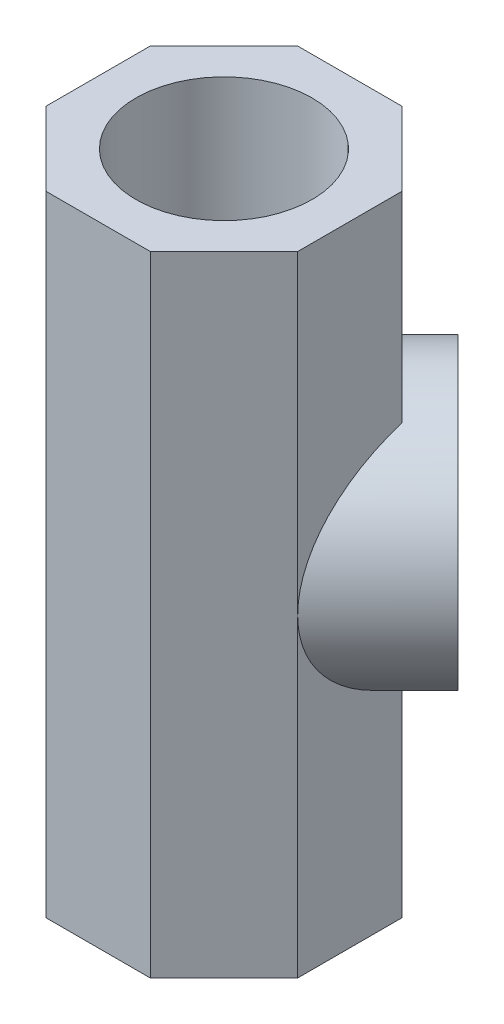
ISO-10303-21;
HEADER;
FILE_DESCRIPTION(('STEP AP214'),'2;1');
FILE_NAME('part.step','',(''),(''),'','','');
FILE_SCHEMA(('AUTOMOTIVE_DESIGN { 1 0 10303 214 1 1 1 1 }'));
ENDSEC;
DATA;
#1=APPLICATION_CONTEXT('core data for automotive mechanical design processes');
#2=APPLICATION_PROTOCOL_DEFINITION('international standard','automotive_design',2000,#1);
#3=PRODUCT_CONTEXT('',#1,'mechanical');
#4=PRODUCT('Part','Part','',(#3));
#5=PRODUCT_RELATED_PRODUCT_CATEGORY('part','',(#4));
#6=PRODUCT_DEFINITION_FORMATION('','',#4);
#7=PRODUCT_DEFINITION_CONTEXT('part definition',#1,'design');
#8=PRODUCT_DEFINITION('design','',#6,#7);
#9=PRODUCT_DEFINITION_SHAPE('','',#8);
#10=(LENGTH_UNIT() NAMED_UNIT(*) SI_UNIT(.MILLI.,.METRE.));
#11=(NAMED_UNIT(*) PLANE_ANGLE_UNIT() SI_UNIT($,.RADIAN.));
#12=(NAMED_UNIT(*) SI_UNIT($,.STERADIAN.) SOLID_ANGLE_UNIT());
#13=UNCERTAINTY_MEASURE_WITH_UNIT(LENGTH_MEASURE(1.E-05),#10,'distance_accuracy_value','');
#14=(GEOMETRIC_REPRESENTATION_CONTEXT(3) GLOBAL_UNCERTAINTY_ASSIGNED_CONTEXT((#13)) GLOBAL_UNIT_ASSIGNED_CONTEXT((#10,
#11,#12)) REPRESENTATION_CONTEXT('',''));
#15=CARTESIAN_POINT('',(0.,0.,0.));
#16=DIRECTION('',(0.,0.,1.));
#17=DIRECTION('',(1.,0.,0.));
#18=AXIS2_PLACEMENT_3D('',#15,#16,#17);
#19=CARTESIAN_POINT('',(15.875,79.375,6.57564030267288));
#20=DIRECTION('',(-1.,0.,0.));
#21=DIRECTION('',(0.,0.,1.));
#22=AXIS2_PLACEMENT_3D('',#19,#20,#21);
#23=PLANE('',#22);
#24=DIRECTION('',(0.,-1.,0.));
#25=VECTOR('',#24,1.);
#26=CARTESIAN_POINT('',(15.875,79.375,-6.57564030267288));
#27=LINE('',#26,#25);
#28=CARTESIAN_POINT('',(15.875,25.1855749109129,-6.57564030267288));
#29=VERTEX_POINT('',#28);
#30=CARTESIAN_POINT('',(15.875,0.,-6.57564030267288));
#31=VERTEX_POINT('',#30);
#32=EDGE_CURVE('E171',#29,#31,#27,.T.);
#33=ORIENTED_EDGE('',*,*,#32,.F.);
#34=CARTESIAN_POINT('',(15.8749999999372,39.6346779837838,-15.8749999999372));
#35=DIRECTION('',(-1.,0.,0.));
#36=DIRECTION('',(0.,0.,-1.));
#37=AXIS2_PLACEMENT_3D('',#34,#35,#36);
#38=ELLIPSE('',#37,22.4506403026729,15.875);
#39=CARTESIAN_POINT('',(15.8749999999373,39.6346779837838,6.57564030273563));
#40=VERTEX_POINT('',#39);
#41=EDGE_CURVE('E185',#40,#29,#38,.F.);
#42=ORIENTED_EDGE('',*,*,#41,.F.);
#43=DIRECTION('',(0.,-1.,0.));
#44=VECTOR('',#43,1.);
#45=CARTESIAN_POINT('',(15.875,79.375,6.57564030267288));
#46=LINE('',#45,#44);
#47=CARTESIAN_POINT('',(15.875,0.,6.57564030267288));
#48=VERTEX_POINT('',#47);
#49=EDGE_CURVE('E174',#40,#48,#46,.T.);
#50=ORIENTED_EDGE('',*,*,#49,.T.);
#51=DIRECTION('',(0.,0.,-1.));
#52=VECTOR('',#51,1.);
#53=CARTESIAN_POINT('',(15.875,0.,6.57564030267288));
#54=LINE('',#53,#52);
#55=EDGE_CURVE('E149',#48,#31,#54,.T.);
#56=ORIENTED_EDGE('',*,*,#55,.T.);
#57=EDGE_LOOP('',(#33,#42,#50,#56));
#58=FACE_BOUND('',#57,.T.);
#59=ADVANCED_FACE('F33',(#58),#23,.F.);
#60=CARTESIAN_POINT('',(15.875,79.375,-6.57564030267288));
#61=DIRECTION('',(-0.707106781186547,0.,0.707106781186548));
#62=DIRECTION('',(0.707106781186548,0.,0.707106781186547));
#63=AXIS2_PLACEMENT_3D('',#60,#61,#62);
#64=PLANE('',#63);
#65=CARTESIAN_POINT('',(15.875,79.375,-6.57564030267288));
#66=VERTEX_POINT('',#65);
#67=CARTESIAN_POINT('',(15.8749999999464,54.0837810566528,-6.5756403026193));
#68=VERTEX_POINT('',#67);
#69=EDGE_CURVE('E172',#66,#68,#27,.T.);
#70=ORIENTED_EDGE('',*,*,#69,.T.);
#71=CARTESIAN_POINT('',(11.2253201513113,39.6346779837838,-11.2253201512544));
#72=DIRECTION('',(-0.707106781186547,0.,0.707106781186548));
#73=DIRECTION('',(0.707106781186548,0.,0.707106781186547));
#74=AXIS2_PLACEMENT_3D('',#71,#72,#73);
#75=CIRCLE('',#74,15.875);
#76=CARTESIAN_POINT('',(6.57564030267287,54.0837810566181,-15.875));
#77=VERTEX_POINT('',#76);
#78=EDGE_CURVE('E211',#77,#68,#75,.F.);
#79=ORIENTED_EDGE('',*,*,#78,.F.);
#80=DIRECTION('',(0.,-1.,0.));
#81=VECTOR('',#80,1.);
#82=CARTESIAN_POINT('',(6.57564030267287,79.375,-15.875));
#83=LINE('',#82,#81);
#84=CARTESIAN_POINT('',(6.57564030267287,79.375,-15.875));
#85=VERTEX_POINT('',#84);
#86=EDGE_CURVE('E168',#85,#77,#83,.T.);
#87=ORIENTED_EDGE('',*,*,#86,.F.);
#88=DIRECTION('',(-0.707106781186548,0.,-0.707106781186547));
#89=VECTOR('',#88,1.);
#90=CARTESIAN_POINT('',(15.875,79.375,-6.57564030267288));
#91=LINE('',#90,#89);
#92=EDGE_CURVE('E226',#66,#85,#91,.T.);
#93=ORIENTED_EDGE('',*,*,#92,.F.);
#94=EDGE_LOOP('',(#70,#79,#87,#93));
#95=FACE_BOUND('',#94,.T.);
#96=ADVANCED_FACE('F230',(#95),#64,.F.);
#97=CARTESIAN_POINT('',(6.57564030267287,79.375,-15.875));
#98=DIRECTION('',(0.,0.,1.));
#99=DIRECTION('',(1.,0.,0.));
#100=AXIS2_PLACEMENT_3D('',#97,#98,#99);
#101=PLANE('',#100);
#102=ORIENTED_EDGE('',*,*,#86,.T.);
#103=CARTESIAN_POINT('',(15.8750000000509,39.6346779837838,-15.8749999999941));
#104=DIRECTION('',(0.,0.,1.));
#105=DIRECTION('',(1.,0.,0.));
#106=AXIS2_PLACEMENT_3D('',#103,#104,#105);
#107=ELLIPSE('',#106,22.4506403026729,15.875);
#108=CARTESIAN_POINT('',(-6.57564030262195,39.6346779837838,-15.8749999999941));
#109=VERTEX_POINT('',#108);
#110=EDGE_CURVE('E233',#109,#77,#107,.F.);
#111=ORIENTED_EDGE('',*,*,#110,.F.);
#112=DIRECTION('',(0.,-1.,0.));
#113=VECTOR('',#112,1.);
#114=CARTESIAN_POINT('',(-6.57564030267289,79.375,-15.875));
#115=LINE('',#114,#113);
#116=CARTESIAN_POINT('',(-6.57564030267289,79.375,-15.875));
#117=VERTEX_POINT('',#116);
#118=EDGE_CURVE('E165',#117,#109,#115,.T.);
#119=ORIENTED_EDGE('',*,*,#118,.F.);
#120=DIRECTION('',(-1.,0.,0.));
#121=VECTOR('',#120,1.);
#122=CARTESIAN_POINT('',(6.57564030267287,79.375,-15.875));
#123=LINE('',#122,#121);
#124=EDGE_CURVE('E121',#85,#117,#123,.T.);
#125=ORIENTED_EDGE('',*,*,#124,.F.);
#126=EDGE_LOOP('',(#102,#111,#119,#125));
#127=FACE_BOUND('',#126,.T.);
#128=ADVANCED_FACE('F232',(#127),#101,.F.);
#129=CARTESIAN_POINT('',(0.,79.375,0.));
#130=DIRECTION('',(0.,1.,0.));
#131=DIRECTION('',(0.,0.,1.));
#132=AXIS2_PLACEMENT_3D('',#129,#130,#131);
#133=PLANE('',#132);
#134=DIRECTION('',(1.,0.,0.));
#135=VECTOR('',#134,1.);
#136=CARTESIAN_POINT('',(-6.57564030267289,79.375,15.875));
#137=LINE('',#136,#135);
#138=CARTESIAN_POINT('',(-6.57564030267289,79.375,15.875));
#139=VERTEX_POINT('',#138);
#140=CARTESIAN_POINT('',(6.57564030267288,79.375,15.875));
#141=VERTEX_POINT('',#140);
#142=EDGE_CURVE('E162',#139,#141,#137,.T.);
#143=ORIENTED_EDGE('',*,*,#142,.T.);
#144=DIRECTION('',(0.707106781186548,0.,-0.707106781186548));
#145=VECTOR('',#144,1.);
#146=CARTESIAN_POINT('',(6.57564030267288,79.375,15.875));
#147=LINE('',#146,#145);
#148=CARTESIAN_POINT('',(15.875,79.375,6.57564030267288));
#149=VERTEX_POINT('',#148);
#150=EDGE_CURVE('E98',#141,#149,#147,.T.);
#151=ORIENTED_EDGE('',*,*,#150,.T.);
#152=DIRECTION('',(0.,0.,-1.));
#153=VECTOR('',#152,1.);
#154=CARTESIAN_POINT('',(15.875,79.375,6.57564030267288));
#155=LINE('',#154,#153);
#156=EDGE_CURVE('E224',#149,#66,#155,.T.);
#157=ORIENTED_EDGE('',*,*,#156,.T.);
#158=ORIENTED_EDGE('',*,*,#92,.T.);
#159=ORIENTED_EDGE('',*,*,#124,.T.);
#160=DIRECTION('',(-0.707106781186547,0.,0.707106781186548));
#161=VECTOR('',#160,1.);
#162=CARTESIAN_POINT('',(-6.57564030267289,79.375,-15.875));
#163=LINE('',#162,#161);
#164=CARTESIAN_POINT('',(-15.875,79.375,-6.57564030267288));
#165=VERTEX_POINT('',#164);
#166=EDGE_CURVE('E113',#117,#165,#163,.T.);
#167=ORIENTED_EDGE('',*,*,#166,.T.);
#168=DIRECTION('',(0.,0.,1.));
#169=VECTOR('',#168,1.);
#170=CARTESIAN_POINT('',(-15.875,79.375,-6.57564030267288));
#171=LINE('',#170,#169);
#172=CARTESIAN_POINT('',(-15.875,79.375,6.57564030267289));
#173=VERTEX_POINT('',#172);
#174=EDGE_CURVE('E118',#165,#173,#171,.T.);
#175=ORIENTED_EDGE('',*,*,#174,.T.);
#176=DIRECTION('',(0.707106781186547,0.,0.707106781186547));
#177=VECTOR('',#176,1.);
#178=CARTESIAN_POINT('',(-15.875,79.375,6.57564030267289));
#179=LINE('',#178,#177);
#180=EDGE_CURVE('E57',#173,#139,#179,.T.);
#181=ORIENTED_EDGE('',*,*,#180,.T.);
#182=EDGE_LOOP('',(#143,#151,#157,#158,#159,#167,#175,#181));
#183=FACE_BOUND('',#182,.T.);
#184=CARTESIAN_POINT('',(0.,79.375,0.));
#185=DIRECTION('',(0.,1.,0.));
#186=DIRECTION('',(0.,0.,1.));
#187=AXIS2_PLACEMENT_3D('',#184,#185,#186);
#188=CIRCLE('',#187,11.1125);
#189=CARTESIAN_POINT('',(0.,79.375,-11.1125));
#190=VERTEX_POINT('',#189);
#191=EDGE_CURVE('E146',#190,#190,#188,.T.);
#192=ORIENTED_EDGE('',*,*,#191,.F.);
#193=EDGE_LOOP('',(#192));
#194=FACE_BOUND('',#193,.T.);
#195=ADVANCED_FACE('F115',(#183,#194),#133,.T.);
#196=CARTESIAN_POINT('',(0.,0.,0.));
#197=DIRECTION('',(0.,1.,0.));
#198=DIRECTION('',(0.,0.,1.));
#199=AXIS2_PLACEMENT_3D('',#196,#197,#198);
#200=PLANE('',#199);
#201=DIRECTION('',(1.,0.,0.));
#202=VECTOR('',#201,1.);
#203=CARTESIAN_POINT('',(-6.57564030267289,0.,15.875));
#204=LINE('',#203,#202);
#205=CARTESIAN_POINT('',(-6.57564030267289,0.,15.875));
#206=VERTEX_POINT('',#205);
#207=CARTESIAN_POINT('',(6.57564030267288,0.,15.875));
#208=VERTEX_POINT('',#207);
#209=EDGE_CURVE('E142',#206,#208,#204,.T.);
#210=ORIENTED_EDGE('',*,*,#209,.F.);
#211=DIRECTION('',(0.707106781186547,0.,0.707106781186547));
#212=VECTOR('',#211,1.);
#213=CARTESIAN_POINT('',(-15.875,0.,6.57564030267289));
#214=LINE('',#213,#212);
#215=CARTESIAN_POINT('',(-15.875,0.,6.57564030267289));
#216=VERTEX_POINT('',#215);
#217=EDGE_CURVE('E90',#216,#206,#214,.T.);
#218=ORIENTED_EDGE('',*,*,#217,.F.);
#219=DIRECTION('',(0.,0.,1.));
#220=VECTOR('',#219,1.);
#221=CARTESIAN_POINT('',(-15.875,0.,-6.57564030267288));
#222=LINE('',#221,#220);
#223=CARTESIAN_POINT('',(-15.875,0.,-6.57564030267288));
#224=VERTEX_POINT('',#223);
#225=EDGE_CURVE('E159',#224,#216,#222,.T.);
#226=ORIENTED_EDGE('',*,*,#225,.F.);
#227=DIRECTION('',(-0.707106781186547,0.,0.707106781186548));
#228=VECTOR('',#227,1.);
#229=CARTESIAN_POINT('',(-6.57564030267289,0.,-15.875));
#230=LINE('',#229,#228);
#231=CARTESIAN_POINT('',(-6.57564030267289,0.,-15.875));
#232=VERTEX_POINT('',#231);
#233=EDGE_CURVE('E130',#232,#224,#230,.T.);
#234=ORIENTED_EDGE('',*,*,#233,.F.);
#235=DIRECTION('',(-1.,0.,0.));
#236=VECTOR('',#235,1.);
#237=CARTESIAN_POINT('',(6.57564030267287,0.,-15.875));
#238=LINE('',#237,#236);
#239=CARTESIAN_POINT('',(6.57564030267287,0.,-15.875));
#240=VERTEX_POINT('',#239);
#241=EDGE_CURVE('E155',#240,#232,#238,.T.);
#242=ORIENTED_EDGE('',*,*,#241,.F.);
#243=DIRECTION('',(-0.707106781186548,0.,-0.707106781186547));
#244=VECTOR('',#243,1.);
#245=CARTESIAN_POINT('',(15.875,0.,-6.57564030267288));
#246=LINE('',#245,#244);
#247=EDGE_CURVE('E152',#31,#240,#246,.T.);
#248=ORIENTED_EDGE('',*,*,#247,.F.);
#249=ORIENTED_EDGE('',*,*,#55,.F.);
#250=DIRECTION('',(0.707106781186548,0.,-0.707106781186548));
#251=VECTOR('',#250,1.);
#252=CARTESIAN_POINT('',(6.57564030267288,0.,15.875));
#253=LINE('',#252,#251);
#254=EDGE_CURVE('E145',#208,#48,#253,.T.);
#255=ORIENTED_EDGE('',*,*,#254,.F.);
#256=EDGE_LOOP('',(#210,#218,#226,#234,#242,#248,#249,#255));
#257=FACE_BOUND('',#256,.T.);
#258=CARTESIAN_POINT('',(0.,0.,0.));
#259=DIRECTION('',(0.,1.,0.));
#260=DIRECTION('',(0.,0.,1.));
#261=AXIS2_PLACEMENT_3D('',#258,#259,#260);
#262=CIRCLE('',#261,11.1125);
#263=CARTESIAN_POINT('',(0.,0.,-11.1125));
#264=VERTEX_POINT('',#263);
#265=EDGE_CURVE('E214',#264,#264,#262,.T.);
#266=ORIENTED_EDGE('',*,*,#265,.T.);
#267=EDGE_LOOP('',(#266));
#268=FACE_BOUND('',#267,.T.);
#269=ADVANCED_FACE('F190',(#257,#268),#200,.F.);
#270=CARTESIAN_POINT('',(-6.57564030267289,79.375,15.875));
#271=DIRECTION('',(0.,0.,-1.));
#272=DIRECTION('',(-1.,0.,0.));
#273=AXIS2_PLACEMENT_3D('',#270,#271,#272);
#274=PLANE('',#273);
#275=ORIENTED_EDGE('',*,*,#209,.T.);
#276=DIRECTION('',(0.,-1.,0.));
#277=VECTOR('',#276,1.);
#278=CARTESIAN_POINT('',(6.57564030267288,79.375,15.875));
#279=LINE('',#278,#277);
#280=EDGE_CURVE('E11',#141,#208,#279,.T.);
#281=ORIENTED_EDGE('',*,*,#280,.F.);
#282=ORIENTED_EDGE('',*,*,#142,.F.);
#283=DIRECTION('',(0.,-1.,0.));
#284=VECTOR('',#283,1.);
#285=CARTESIAN_POINT('',(-6.57564030267289,79.375,15.875));
#286=LINE('',#285,#284);
#287=EDGE_CURVE('E138',#139,#206,#286,.T.);
#288=ORIENTED_EDGE('',*,*,#287,.T.);
#289=EDGE_LOOP('',(#275,#281,#282,#288));
#290=FACE_BOUND('',#289,.T.);
#291=ADVANCED_FACE('F35',(#290),#274,.F.);
#292=CARTESIAN_POINT('',(6.57564030267288,79.375,15.875));
#293=DIRECTION('',(-0.707106781186548,0.,-0.707106781186547));
#294=DIRECTION('',(-0.707106781186547,0.,0.707106781186548));
#295=AXIS2_PLACEMENT_3D('',#292,#293,#294);
#296=PLANE('',#295);
#297=ORIENTED_EDGE('',*,*,#254,.T.);
#298=ORIENTED_EDGE('',*,*,#49,.F.);
#299=EDGE_CURVE('E41',#149,#40,#46,.T.);
#300=ORIENTED_EDGE('',*,*,#299,.F.);
#301=ORIENTED_EDGE('',*,*,#150,.F.);
#302=ORIENTED_EDGE('',*,*,#280,.T.);
#303=EDGE_LOOP('',(#297,#298,#300,#301,#302));
#304=FACE_BOUND('',#303,.T.);
#305=ADVANCED_FACE('F186',(#304),#296,.F.);
#306=ORIENTED_EDGE('',*,*,#299,.T.);
#307=EDGE_CURVE('E208',#68,#40,#38,.F.);
#308=ORIENTED_EDGE('',*,*,#307,.F.);
#309=ORIENTED_EDGE('',*,*,#69,.F.);
#310=ORIENTED_EDGE('',*,*,#156,.F.);
#311=EDGE_LOOP('',(#306,#308,#309,#310));
#312=FACE_BOUND('',#311,.T.);
#313=ADVANCED_FACE('F240',(#312),#23,.F.);
#314=CARTESIAN_POINT('',(6.57564030267287,25.1855749109495,-15.875));
#315=VERTEX_POINT('',#314);
#316=EDGE_CURVE('E167',#315,#240,#83,.T.);
#317=ORIENTED_EDGE('',*,*,#316,.F.);
#318=EDGE_CURVE('E48',#29,#315,#75,.F.);
#319=ORIENTED_EDGE('',*,*,#318,.F.);
#320=ORIENTED_EDGE('',*,*,#32,.T.);
#321=ORIENTED_EDGE('',*,*,#247,.T.);
#322=EDGE_LOOP('',(#317,#319,#320,#321));
#323=FACE_BOUND('',#322,.T.);
#324=ADVANCED_FACE('F195',(#323),#64,.F.);
#325=EDGE_CURVE('E133',#109,#232,#115,.T.);
#326=ORIENTED_EDGE('',*,*,#325,.F.);
#327=EDGE_CURVE('E206',#315,#109,#107,.F.);
#328=ORIENTED_EDGE('',*,*,#327,.F.);
#329=ORIENTED_EDGE('',*,*,#316,.T.);
#330=ORIENTED_EDGE('',*,*,#241,.T.);
#331=EDGE_LOOP('',(#326,#328,#329,#330));
#332=FACE_BOUND('',#331,.T.);
#333=ADVANCED_FACE('F236',(#332),#101,.F.);
#334=CARTESIAN_POINT('',(-6.57564030267289,79.375,-15.875));
#335=DIRECTION('',(0.707106781186548,0.,0.707106781186547));
#336=DIRECTION('',(0.707106781186547,0.,-0.707106781186548));
#337=AXIS2_PLACEMENT_3D('',#334,#335,#336);
#338=PLANE('',#337);
#339=ORIENTED_EDGE('',*,*,#233,.T.);
#340=DIRECTION('',(0.,-1.,0.));
#341=VECTOR('',#340,1.);
#342=CARTESIAN_POINT('',(-15.875,79.375,-6.57564030267288));
#343=LINE('',#342,#341);
#344=EDGE_CURVE('E127',#165,#224,#343,.T.);
#345=ORIENTED_EDGE('',*,*,#344,.F.);
#346=ORIENTED_EDGE('',*,*,#166,.F.);
#347=ORIENTED_EDGE('',*,*,#118,.T.);
#348=ORIENTED_EDGE('',*,*,#325,.T.);
#349=EDGE_LOOP('',(#339,#345,#346,#347,#348));
#350=FACE_BOUND('',#349,.T.);
#351=ADVANCED_FACE('F128',(#350),#338,.F.);
#352=CARTESIAN_POINT('',(-15.875,79.375,-6.57564030267288));
#353=DIRECTION('',(1.,0.,0.));
#354=DIRECTION('',(0.,0.,-1.));
#355=AXIS2_PLACEMENT_3D('',#352,#353,#354);
#356=PLANE('',#355);
#357=ORIENTED_EDGE('',*,*,#225,.T.);
#358=DIRECTION('',(0.,-1.,0.));
#359=VECTOR('',#358,1.);
#360=CARTESIAN_POINT('',(-15.875,79.375,6.57564030267289));
#361=LINE('',#360,#359);
#362=EDGE_CURVE('E134',#173,#216,#361,.T.);
#363=ORIENTED_EDGE('',*,*,#362,.F.);
#364=ORIENTED_EDGE('',*,*,#174,.F.);
#365=ORIENTED_EDGE('',*,*,#344,.T.);
#366=EDGE_LOOP('',(#357,#363,#364,#365));
#367=FACE_BOUND('',#366,.T.);
#368=ADVANCED_FACE('F136',(#367),#356,.F.);
#369=CARTESIAN_POINT('',(-15.875,79.375,6.57564030267289));
#370=DIRECTION('',(0.707106781186547,0.,-0.707106781186547));
#371=DIRECTION('',(-0.707106781186548,0.,-0.707106781186548));
#372=AXIS2_PLACEMENT_3D('',#369,#370,#371);
#373=PLANE('',#372);
#374=ORIENTED_EDGE('',*,*,#217,.T.);
#375=ORIENTED_EDGE('',*,*,#287,.F.);
#376=ORIENTED_EDGE('',*,*,#180,.F.);
#377=ORIENTED_EDGE('',*,*,#362,.T.);
#378=EDGE_LOOP('',(#374,#375,#376,#377));
#379=FACE_BOUND('',#378,.T.);
#380=ADVANCED_FACE('F237',(#379),#373,.F.);
#381=CARTESIAN_POINT('',(0.,79.375,0.));
#382=DIRECTION('',(0.,-1.,0.));
#383=DIRECTION('',(0.,0.,-1.));
#384=AXIS2_PLACEMENT_3D('',#381,#382,#383);
#385=CYLINDRICAL_SURFACE('',#384,11.1125);
#386=CARTESIAN_POINT('',(0.,79.375,-11.1125));
#387=CARTESIAN_POINT('',(0.,78.5481770833333,-11.1125));
#388=CARTESIAN_POINT('',(0.,77.7213541666667,-11.1125));
#389=CARTESIAN_POINT('',(0.,76.0677083333333,-11.1125));
#390=CARTESIAN_POINT('',(0.,75.2408854166667,-11.1125));
#391=CARTESIAN_POINT('',(0.,73.5872395833333,-11.1125));
#392=CARTESIAN_POINT('',(0.,72.7604166666667,-11.1125));
#393=CARTESIAN_POINT('',(0.,71.1067708333333,-11.1125));
#394=CARTESIAN_POINT('',(0.,70.2799479166667,-11.1125));
#395=CARTESIAN_POINT('',(0.,68.6263020833333,-11.1125));
#396=CARTESIAN_POINT('',(0.,67.7994791666667,-11.1125));
#397=CARTESIAN_POINT('',(0.,66.1458333333333,-11.1125));
#398=CARTESIAN_POINT('',(0.,65.3190104166667,-11.1125));
#399=CARTESIAN_POINT('',(0.,63.6653645833333,-11.1125));
#400=CARTESIAN_POINT('',(0.,62.8385416666667,-11.1125));
#401=CARTESIAN_POINT('',(0.,61.1848958333333,-11.1125));
#402=CARTESIAN_POINT('',(0.,60.3580729166667,-11.1125));
#403=CARTESIAN_POINT('',(0.,58.7044270833333,-11.1125));
#404=CARTESIAN_POINT('',(0.,57.8776041666667,-11.1125));
#405=CARTESIAN_POINT('',(0.,56.2239583333333,-11.1125));
#406=CARTESIAN_POINT('',(0.,55.3971354166667,-11.1125));
#407=CARTESIAN_POINT('',(0.,53.7434895833333,-11.1125));
#408=CARTESIAN_POINT('',(0.,52.9166666666667,-11.1125));
#409=CARTESIAN_POINT('',(0.,51.2630208333333,-11.1125));
#410=CARTESIAN_POINT('',(0.,50.4361979166667,-11.1125));
#411=CARTESIAN_POINT('',(0.,48.7825520833333,-11.1125));
#412=CARTESIAN_POINT('',(0.,47.9557291666667,-11.1125));
#413=CARTESIAN_POINT('',(0.,46.3020833333333,-11.1125));
#414=CARTESIAN_POINT('',(0.,45.4752604166667,-11.1125));
#415=CARTESIAN_POINT('',(0.,43.8216145833333,-11.1125));
#416=CARTESIAN_POINT('',(0.,42.9947916666667,-11.1125));
#417=CARTESIAN_POINT('',(0.,41.3411458333333,-11.1125));
#418=CARTESIAN_POINT('',(0.,40.5143229166667,-11.1125));
#419=CARTESIAN_POINT('',(0.,38.8606770833333,-11.1125));
#420=CARTESIAN_POINT('',(0.,38.0338541666667,-11.1125));
#421=CARTESIAN_POINT('',(0.,36.3802083333333,-11.1125));
#422=CARTESIAN_POINT('',(0.,35.5533854166667,-11.1125));
#423=CARTESIAN_POINT('',(0.,33.8997395833333,-11.1125));
#424=CARTESIAN_POINT('',(0.,33.0729166666667,-11.1125));
#425=CARTESIAN_POINT('',(0.,31.4192708333333,-11.1125));
#426=CARTESIAN_POINT('',(0.,30.5924479166667,-11.1125));
#427=CARTESIAN_POINT('',(0.,28.9388020833333,-11.1125));
#428=CARTESIAN_POINT('',(0.,28.1119791666667,-11.1125));
#429=CARTESIAN_POINT('',(0.,26.4583333333333,-11.1125));
#430=CARTESIAN_POINT('',(0.,25.6315104166667,-11.1125));
#431=CARTESIAN_POINT('',(0.,23.9778645833333,-11.1125));
#432=CARTESIAN_POINT('',(0.,23.1510416666667,-11.1125));
#433=CARTESIAN_POINT('',(0.,21.4973958333333,-11.1125));
#434=CARTESIAN_POINT('',(0.,20.6705729166667,-11.1125));
#435=CARTESIAN_POINT('',(0.,19.0169270833333,-11.1125));
#436=CARTESIAN_POINT('',(0.,18.1901041666667,-11.1125));
#437=CARTESIAN_POINT('',(0.,16.5364583333333,-11.1125));
#438=CARTESIAN_POINT('',(0.,15.7096354166667,-11.1125));
#439=CARTESIAN_POINT('',(0.,14.0559895833333,-11.1125));
#440=CARTESIAN_POINT('',(0.,13.2291666666667,-11.1125));
#441=CARTESIAN_POINT('',(0.,11.5755208333333,-11.1125));
#442=CARTESIAN_POINT('',(0.,10.7486979166667,-11.1125));
#443=CARTESIAN_POINT('',(0.,9.09505208333332,-11.1125));
#444=CARTESIAN_POINT('',(0.,8.26822916666666,-11.1125));
#445=CARTESIAN_POINT('',(0.,6.61458333333332,-11.1125));
#446=CARTESIAN_POINT('',(0.,5.78776041666665,-11.1125));
#447=CARTESIAN_POINT('',(0.,4.13411458333332,-11.1125));
#448=CARTESIAN_POINT('',(0.,3.30729166666666,-11.1125));
#449=CARTESIAN_POINT('',(0.,1.65364583333332,-11.1125));
#450=CARTESIAN_POINT('',(0.,0.826822916666655,-11.1125));
#451=CARTESIAN_POINT('',(0.,0.,-11.1125));
#452=B_SPLINE_CURVE_WITH_KNOTS('',3,(#386,#387,#388,#389,#390,#391,#392,#393,#394,#395,#396,
#397,#398,#399,#400,#401,#402,#403,#404,#405,#406,#407,#408,#409,#410,#411,#412,#413,#414,#415,
#416,#417,#418,#419,#420,#421,#422,#423,#424,#425,#426,#427,#428,#429,#430,#431,#432,#433,#434,
#435,#436,#437,#438,#439,#440,#441,#442,#443,#444,#445,#446,#447,#448,#449,#450,#451),
.UNSPECIFIED.,.F.,.F.,(4,2,2,2,2,2,2,2,2,2,2,2,2,2,2,2,2,2,2,2,2,2,2,2,2,2,2,2,2,2,2,2,4),(0.,
2.48046874999999,4.9609375,7.44140624999999,9.921875,12.40234375,14.8828125,17.36328125,
19.84375,22.32421875,24.8046875,27.28515625,29.765625,32.24609375,34.7265625,37.20703125,
39.6875,42.16796875,44.6484375,47.12890625,49.609375,52.08984375,54.5703125,57.05078125,
59.53125,62.01171875,64.4921875,66.97265625,69.453125,71.93359375,74.4140625,76.89453125,
79.375),.UNSPECIFIED.);
#453=EDGE_CURVE('BSEAM264',#190,#264,#452,.T.);
#454=ORIENTED_EDGE('',*,*,#191,.T.);
#455=ORIENTED_EDGE('',*,*,#265,.F.);
#456=ORIENTED_EDGE('',*,*,#453,.T.);
#457=ORIENTED_EDGE('',*,*,#453,.F.);
#458=EDGE_LOOP('',(#454,#456,#455,#457));
#459=FACE_BOUND('',#458,.T.);
#460=ADVANCED_FACE('F264',(#459),#385,.F.);
#461=CARTESIAN_POINT('',(-499988.774679849,39.6346779837838,499988.774679849));
#462=DIRECTION('',(0.707106781186547,0.,-0.707106781186548));
#463=DIRECTION('',(-0.707106781186548,0.,-0.707106781186547));
#464=AXIS2_PLACEMENT_3D('',#461,#462,#463);
#465=CYLINDRICAL_SURFACE('',#464,15.875);
#466=CARTESIAN_POINT('',(14.7608540572692,39.6346779837838,-14.7608540572692));
#467=DIRECTION('',(0.707106781186547,0.,-0.707106781186548));
#468=DIRECTION('',(-0.707106781186548,0.,-0.707106781186547));
#469=AXIS2_PLACEMENT_3D('',#466,#467,#468);
#470=CIRCLE('',#469,15.875);
#471=CARTESIAN_POINT('',(3.53553390593274,39.6346779837838,-25.9861742086056));
#472=VERTEX_POINT('',#471);
#473=EDGE_CURVE('E282',#472,#472,#470,.T.);
#474=ORIENTED_EDGE('',*,*,#473,.F.);
#475=EDGE_LOOP('',(#474));
#476=FACE_BOUND('',#475,.T.);
#477=ORIENTED_EDGE('',*,*,#318,.T.);
#478=ORIENTED_EDGE('',*,*,#327,.T.);
#479=ORIENTED_EDGE('',*,*,#110,.T.);
#480=ORIENTED_EDGE('',*,*,#78,.T.);
#481=ORIENTED_EDGE('',*,*,#307,.T.);
#482=ORIENTED_EDGE('',*,*,#41,.T.);
#483=EDGE_LOOP('',(#477,#478,#479,#480,#481,#482));
#484=FACE_BOUND('',#483,.T.);
#485=ADVANCED_FACE('F209',(#476,#484),#465,.T.);
#486=CARTESIAN_POINT('',(14.7608540572692,39.6346779837838,-14.7608540572692));
#487=DIRECTION('',(0.707106781186547,0.,-0.707106781186548));
#488=DIRECTION('',(-0.707106781186548,0.,-0.707106781186547));
#489=AXIS2_PLACEMENT_3D('',#486,#487,#488);
#490=PLANE('',#489);
#491=ORIENTED_EDGE('',*,*,#473,.T.);
#492=EDGE_LOOP('',(#491));
#493=FACE_BOUND('',#492,.T.);
#494=ADVANCED_FACE('F274',(#493),#490,.T.);
#495=CLOSED_SHELL('',(#59,#96,#128,#195,#269,#291,#305,#313,#324,#333,#351,#368,#380,#460,#485,#494));
#496=MANIFOLD_SOLID_BREP('B2',#495);
#497=ADVANCED_BREP_SHAPE_REPRESENTATION('',(#18,#496),#14);
#498=SHAPE_DEFINITION_REPRESENTATION(#9,#497);
ENDSEC;
END-ISO-10303-21;
